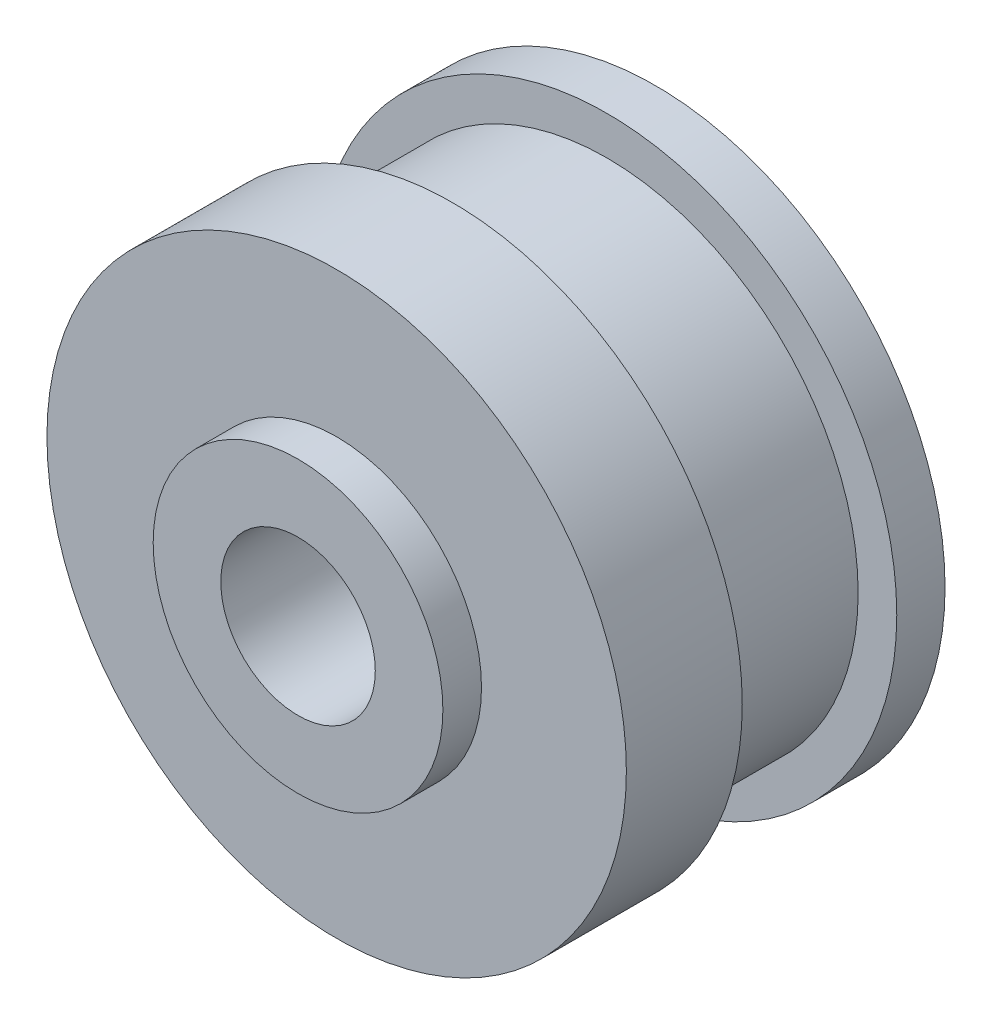
ISO-10303-21;
HEADER;
FILE_DESCRIPTION(('STEP AP214'),'2;1');
FILE_NAME('part.step','',(''),(''),'','','');
FILE_SCHEMA(('AUTOMOTIVE_DESIGN { 1 0 10303 214 1 1 1 1 }'));
ENDSEC;
DATA;
#1=APPLICATION_CONTEXT('core data for automotive mechanical design processes');
#2=APPLICATION_PROTOCOL_DEFINITION('international standard','automotive_design',2000,#1);
#3=PRODUCT_CONTEXT('',#1,'mechanical');
#4=PRODUCT('Part','Part','',(#3));
#5=PRODUCT_RELATED_PRODUCT_CATEGORY('part','',(#4));
#6=PRODUCT_DEFINITION_FORMATION('','',#4);
#7=PRODUCT_DEFINITION_CONTEXT('part definition',#1,'design');
#8=PRODUCT_DEFINITION('design','',#6,#7);
#9=PRODUCT_DEFINITION_SHAPE('','',#8);
#10=(LENGTH_UNIT() NAMED_UNIT(*) SI_UNIT(.MILLI.,.METRE.));
#11=(NAMED_UNIT(*) PLANE_ANGLE_UNIT() SI_UNIT($,.RADIAN.));
#12=(NAMED_UNIT(*) SI_UNIT($,.STERADIAN.) SOLID_ANGLE_UNIT());
#13=UNCERTAINTY_MEASURE_WITH_UNIT(LENGTH_MEASURE(1.E-05),#10,'distance_accuracy_value','');
#14=(GEOMETRIC_REPRESENTATION_CONTEXT(3) GLOBAL_UNCERTAINTY_ASSIGNED_CONTEXT((#13)) GLOBAL_UNIT_ASSIGNED_CONTEXT((#10,
#11,#12)) REPRESENTATION_CONTEXT('',''));
#15=CARTESIAN_POINT('',(0.,0.,0.));
#16=DIRECTION('',(0.,0.,1.));
#17=DIRECTION('',(1.,0.,0.));
#18=AXIS2_PLACEMENT_3D('',#15,#16,#17);
#19=CARTESIAN_POINT('',(0.,0.,16.5));
#20=DIRECTION('',(0.,0.,-1.));
#21=DIRECTION('',(-1.,0.,0.));
#22=AXIS2_PLACEMENT_3D('',#19,#20,#21);
#23=CYLINDRICAL_SURFACE('',#22,15.);
#24=CARTESIAN_POINT('',(0.,0.,16.5));
#25=DIRECTION('',(0.,0.,1.));
#26=DIRECTION('',(1.,0.,0.));
#27=AXIS2_PLACEMENT_3D('',#24,#25,#26);
#28=CIRCLE('',#27,15.);
#29=CARTESIAN_POINT('',(15.,0.,16.5));
#30=VERTEX_POINT('',#29);
#31=EDGE_CURVE('E10',#30,#30,#28,.T.);
#32=ORIENTED_EDGE('',*,*,#31,.F.);
#33=EDGE_LOOP('',(#32));
#34=FACE_BOUND('',#33,.T.);
#35=CARTESIAN_POINT('',(0.,0.,10.5));
#36=DIRECTION('',(0.,0.,-1.));
#37=DIRECTION('',(-1.,0.,0.));
#38=AXIS2_PLACEMENT_3D('',#35,#36,#37);
#39=CIRCLE('',#38,15.);
#40=CARTESIAN_POINT('',(-15.,0.,10.5));
#41=VERTEX_POINT('',#40);
#42=EDGE_CURVE('E74',#41,#41,#39,.T.);
#43=ORIENTED_EDGE('',*,*,#42,.F.);
#44=EDGE_LOOP('',(#43));
#45=FACE_BOUND('',#44,.T.);
#46=ADVANCED_FACE('F45',(#34,#45),#23,.T.);
#47=CARTESIAN_POINT('',(0.,0.,0.));
#48=DIRECTION('',(0.,0.,1.));
#49=DIRECTION('',(1.,0.,0.));
#50=AXIS2_PLACEMENT_3D('',#47,#48,#49);
#51=CIRCLE('',#50,15.);
#52=CARTESIAN_POINT('',(15.,0.,0.));
#53=VERTEX_POINT('',#52);
#54=EDGE_CURVE('E48',#53,#53,#51,.T.);
#55=ORIENTED_EDGE('',*,*,#54,.T.);
#56=EDGE_LOOP('',(#55));
#57=FACE_BOUND('',#56,.T.);
#58=CARTESIAN_POINT('',(0.,0.,2.5));
#59=DIRECTION('',(0.,0.,-1.));
#60=DIRECTION('',(-1.,0.,0.));
#61=AXIS2_PLACEMENT_3D('',#58,#59,#60);
#62=CIRCLE('',#61,15.);
#63=CARTESIAN_POINT('',(-15.,0.,2.5));
#64=VERTEX_POINT('',#63);
#65=EDGE_CURVE('E86',#64,#64,#62,.T.);
#66=ORIENTED_EDGE('',*,*,#65,.T.);
#67=EDGE_LOOP('',(#66));
#68=FACE_BOUND('',#67,.T.);
#69=ADVANCED_FACE('F91',(#57,#68),#23,.T.);
#70=CARTESIAN_POINT('',(0.,0.,16.5));
#71=DIRECTION('',(0.,0.,1.));
#72=DIRECTION('',(1.,0.,0.));
#73=AXIS2_PLACEMENT_3D('',#70,#71,#72);
#74=PLANE('',#73);
#75=ORIENTED_EDGE('',*,*,#31,.T.);
#76=EDGE_LOOP('',(#75));
#77=FACE_BOUND('',#76,.T.);
#78=CARTESIAN_POINT('',(0.,0.,16.5));
#79=DIRECTION('',(0.,0.,1.));
#80=DIRECTION('',(1.,0.,0.));
#81=AXIS2_PLACEMENT_3D('',#78,#79,#80);
#82=CIRCLE('',#81,7.5);
#83=CARTESIAN_POINT('',(7.5,0.,16.5));
#84=VERTEX_POINT('',#83);
#85=EDGE_CURVE('E63',#84,#84,#82,.T.);
#86=ORIENTED_EDGE('',*,*,#85,.F.);
#87=EDGE_LOOP('',(#86));
#88=FACE_BOUND('',#87,.T.);
#89=ADVANCED_FACE('F110',(#77,#88),#74,.T.);
#90=CARTESIAN_POINT('',(0.,0.,0.));
#91=DIRECTION('',(0.,0.,1.));
#92=DIRECTION('',(1.,0.,0.));
#93=AXIS2_PLACEMENT_3D('',#90,#91,#92);
#94=PLANE('',#93);
#95=CARTESIAN_POINT('',(0.,0.,0.));
#96=DIRECTION('',(0.,0.,1.));
#97=DIRECTION('',(1.,0.,0.));
#98=AXIS2_PLACEMENT_3D('',#95,#96,#97);
#99=CIRCLE('',#98,4.);
#100=CARTESIAN_POINT('',(4.,0.,0.));
#101=VERTEX_POINT('',#100);
#102=EDGE_CURVE('E57',#101,#101,#99,.F.);
#103=ORIENTED_EDGE('',*,*,#102,.F.);
#104=EDGE_LOOP('',(#103));
#105=FACE_BOUND('',#104,.T.);
#106=ORIENTED_EDGE('',*,*,#54,.F.);
#107=EDGE_LOOP('',(#106));
#108=FACE_BOUND('',#107,.T.);
#109=ADVANCED_FACE('F134',(#105,#108),#94,.F.);
#110=CARTESIAN_POINT('',(0.,0.,-0.001000000000001));
#111=DIRECTION('',(0.,0.,1.));
#112=DIRECTION('',(1.,0.,0.));
#113=AXIS2_PLACEMENT_3D('',#110,#111,#112);
#114=CYLINDRICAL_SURFACE('',#113,4.);
#115=ORIENTED_EDGE('',*,*,#102,.T.);
#116=EDGE_LOOP('',(#115));
#117=FACE_BOUND('',#116,.T.);
#118=CARTESIAN_POINT('',(0.,0.,18.5));
#119=DIRECTION('',(0.,0.,1.));
#120=DIRECTION('',(1.,0.,0.));
#121=AXIS2_PLACEMENT_3D('',#118,#119,#120);
#122=CIRCLE('',#121,4.);
#123=CARTESIAN_POINT('',(4.,0.,18.5));
#124=VERTEX_POINT('',#123);
#125=EDGE_CURVE('E67',#124,#124,#122,.T.);
#126=ORIENTED_EDGE('',*,*,#125,.T.);
#127=EDGE_LOOP('',(#126));
#128=FACE_BOUND('',#127,.T.);
#129=ADVANCED_FACE('F129',(#117,#128),#114,.F.);
#130=CARTESIAN_POINT('',(0.,0.,18.5));
#131=DIRECTION('',(0.,0.,1.));
#132=DIRECTION('',(1.,0.,0.));
#133=AXIS2_PLACEMENT_3D('',#130,#131,#132);
#134=PLANE('',#133);
#135=CARTESIAN_POINT('',(0.,0.,18.5));
#136=DIRECTION('',(0.,0.,1.));
#137=DIRECTION('',(1.,0.,0.));
#138=AXIS2_PLACEMENT_3D('',#135,#136,#137);
#139=CIRCLE('',#138,7.5);
#140=CARTESIAN_POINT('',(7.5,0.,18.5));
#141=VERTEX_POINT('',#140);
#142=EDGE_CURVE('E62',#141,#141,#139,.T.);
#143=ORIENTED_EDGE('',*,*,#142,.T.);
#144=EDGE_LOOP('',(#143));
#145=FACE_BOUND('',#144,.T.);
#146=ORIENTED_EDGE('',*,*,#125,.F.);
#147=EDGE_LOOP('',(#146));
#148=FACE_BOUND('',#147,.T.);
#149=ADVANCED_FACE('F124',(#145,#148),#134,.T.);
#150=CARTESIAN_POINT('',(0.,0.,18.5));
#151=DIRECTION('',(0.,0.,-1.));
#152=DIRECTION('',(-1.,0.,0.));
#153=AXIS2_PLACEMENT_3D('',#150,#151,#152);
#154=CYLINDRICAL_SURFACE('',#153,7.5);
#155=ORIENTED_EDGE('',*,*,#142,.F.);
#156=EDGE_LOOP('',(#155));
#157=FACE_BOUND('',#156,.T.);
#158=ORIENTED_EDGE('',*,*,#85,.T.);
#159=EDGE_LOOP('',(#158));
#160=FACE_BOUND('',#159,.T.);
#161=ADVANCED_FACE('F117',(#157,#160),#154,.T.);
#162=CARTESIAN_POINT('',(15.,0.,10.5));
#163=DIRECTION('',(0.,0.,-1.));
#164=DIRECTION('',(-1.,0.,0.));
#165=AXIS2_PLACEMENT_3D('',#162,#163,#164);
#166=PLANE('',#165);
#167=ORIENTED_EDGE('',*,*,#42,.T.);
#168=EDGE_LOOP('',(#167));
#169=FACE_BOUND('',#168,.T.);
#170=CARTESIAN_POINT('',(0.,0.,10.5));
#171=DIRECTION('',(0.,0.,-1.));
#172=DIRECTION('',(-1.,0.,0.));
#173=AXIS2_PLACEMENT_3D('',#170,#171,#172);
#174=CIRCLE('',#173,13.);
#175=CARTESIAN_POINT('',(-13.,0.,10.5));
#176=VERTEX_POINT('',#175);
#177=EDGE_CURVE('E78',#176,#176,#174,.T.);
#178=ORIENTED_EDGE('',*,*,#177,.F.);
#179=EDGE_LOOP('',(#178));
#180=FACE_BOUND('',#179,.T.);
#181=ADVANCED_FACE('F101',(#169,#180),#166,.T.);
#182=CARTESIAN_POINT('',(0.,0.,0.));
#183=DIRECTION('',(0.,0.,-1.));
#184=DIRECTION('',(-1.,0.,0.));
#185=AXIS2_PLACEMENT_3D('',#182,#183,#184);
#186=CYLINDRICAL_SURFACE('',#185,13.);
#187=ORIENTED_EDGE('',*,*,#177,.T.);
#188=EDGE_LOOP('',(#187));
#189=FACE_BOUND('',#188,.T.);
#190=CARTESIAN_POINT('',(0.,0.,2.5));
#191=DIRECTION('',(0.,0.,-1.));
#192=DIRECTION('',(-1.,0.,0.));
#193=AXIS2_PLACEMENT_3D('',#190,#191,#192);
#194=CIRCLE('',#193,13.);
#195=CARTESIAN_POINT('',(-13.,0.,2.5));
#196=VERTEX_POINT('',#195);
#197=EDGE_CURVE('E82',#196,#196,#194,.T.);
#198=ORIENTED_EDGE('',*,*,#197,.F.);
#199=EDGE_LOOP('',(#198));
#200=FACE_BOUND('',#199,.T.);
#201=ADVANCED_FACE('F95',(#189,#200),#186,.T.);
#202=CARTESIAN_POINT('',(13.,0.,2.5));
#203=DIRECTION('',(0.,0.,1.));
#204=DIRECTION('',(1.,0.,0.));
#205=AXIS2_PLACEMENT_3D('',#202,#203,#204);
#206=PLANE('',#205);
#207=ORIENTED_EDGE('',*,*,#197,.T.);
#208=EDGE_LOOP('',(#207));
#209=FACE_BOUND('',#208,.T.);
#210=ORIENTED_EDGE('',*,*,#65,.F.);
#211=EDGE_LOOP('',(#210));
#212=FACE_BOUND('',#211,.T.);
#213=ADVANCED_FACE('F93',(#209,#212),#206,.T.);
#214=CLOSED_SHELL('',(#46,#69,#89,#109,#129,#149,#161,#181,#201,#213));
#215=MANIFOLD_SOLID_BREP('B2',#214);
#216=ADVANCED_BREP_SHAPE_REPRESENTATION('',(#18,#215),#14);
#217=SHAPE_DEFINITION_REPRESENTATION(#9,#216);
ENDSEC;
END-ISO-10303-21;
